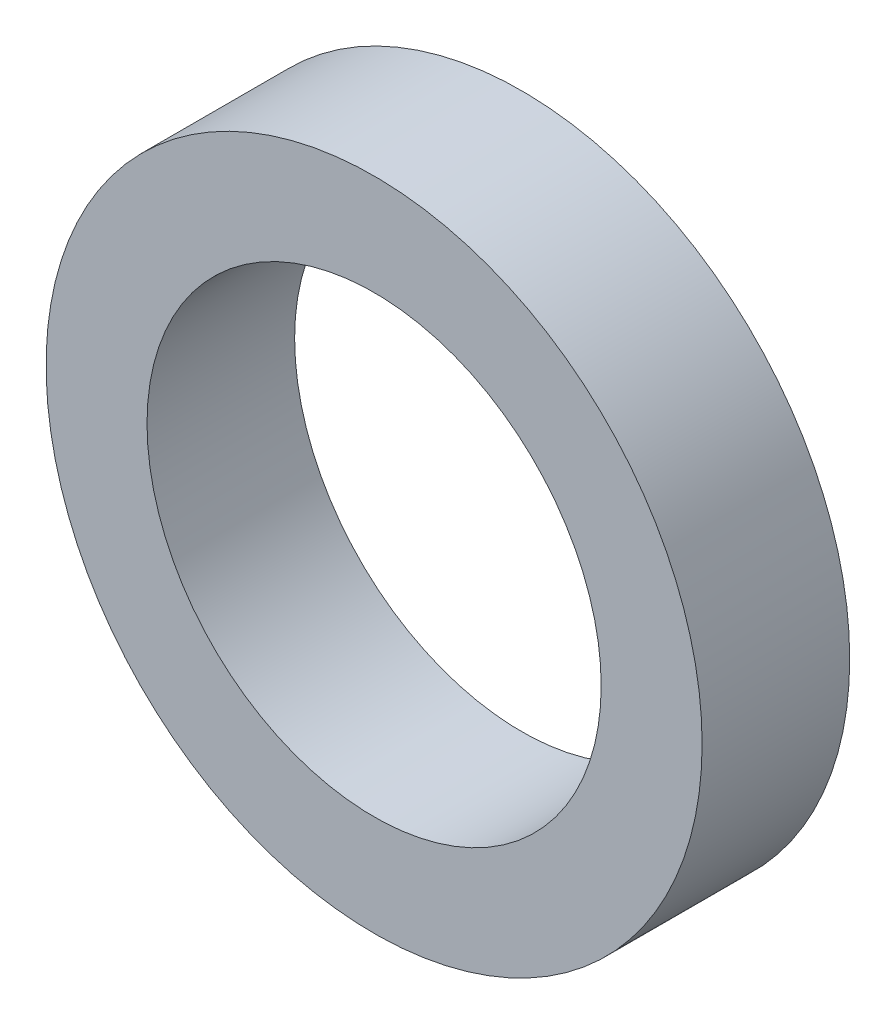
ISO-10303-21;
HEADER;
FILE_DESCRIPTION(('STEP AP214'),'2;1');
FILE_NAME('part.step','',(''),(''),'','','');
FILE_SCHEMA(('AUTOMOTIVE_DESIGN { 1 0 10303 214 1 1 1 1 }'));
ENDSEC;
DATA;
#1=APPLICATION_CONTEXT('core data for automotive mechanical design processes');
#2=APPLICATION_PROTOCOL_DEFINITION('international standard','automotive_design',2000,#1);
#3=PRODUCT_CONTEXT('',#1,'mechanical');
#4=PRODUCT('Part','Part','',(#3));
#5=PRODUCT_RELATED_PRODUCT_CATEGORY('part','',(#4));
#6=PRODUCT_DEFINITION_FORMATION('','',#4);
#7=PRODUCT_DEFINITION_CONTEXT('part definition',#1,'design');
#8=PRODUCT_DEFINITION('design','',#6,#7);
#9=PRODUCT_DEFINITION_SHAPE('','',#8);
#10=(LENGTH_UNIT() NAMED_UNIT(*) SI_UNIT(.MILLI.,.METRE.));
#11=(NAMED_UNIT(*) PLANE_ANGLE_UNIT() SI_UNIT($,.RADIAN.));
#12=(NAMED_UNIT(*) SI_UNIT($,.STERADIAN.) SOLID_ANGLE_UNIT());
#13=UNCERTAINTY_MEASURE_WITH_UNIT(LENGTH_MEASURE(1.E-05),#10,'distance_accuracy_value','');
#14=(GEOMETRIC_REPRESENTATION_CONTEXT(3) GLOBAL_UNCERTAINTY_ASSIGNED_CONTEXT((#13)) GLOBAL_UNIT_ASSIGNED_CONTEXT((#10,
#11,#12)) REPRESENTATION_CONTEXT('',''));
#15=CARTESIAN_POINT('',(0.,0.,0.));
#16=DIRECTION('',(0.,0.,1.));
#17=DIRECTION('',(1.,0.,0.));
#18=AXIS2_PLACEMENT_3D('',#15,#16,#17);
#19=CARTESIAN_POINT('',(13.0091,13.0091,0.009099999999989));
#20=DIRECTION('',(0.,0.,1.));
#21=DIRECTION('',(1.,0.,0.));
#22=AXIS2_PLACEMENT_3D('',#19,#20,#21);
#23=CYLINDRICAL_SURFACE('',#22,9.);
#24=CARTESIAN_POINT('',(13.0091,13.0091,0.009099999999989));
#25=DIRECTION('',(0.,0.,1.));
#26=DIRECTION('',(1.,0.,0.));
#27=AXIS2_PLACEMENT_3D('',#24,#25,#26);
#28=CIRCLE('',#27,9.);
#29=CARTESIAN_POINT('',(22.0091,13.0091,0.009099999999989));
#30=VERTEX_POINT('',#29);
#31=EDGE_CURVE('E26',#30,#30,#28,.F.);
#32=ORIENTED_EDGE('',*,*,#31,.T.);
#33=EDGE_LOOP('',(#32));
#34=FACE_BOUND('',#33,.T.);
#35=CARTESIAN_POINT('',(13.0091,13.0091,5.8591));
#36=DIRECTION('',(0.,0.,1.));
#37=DIRECTION('',(1.,0.,0.));
#38=AXIS2_PLACEMENT_3D('',#35,#36,#37);
#39=CIRCLE('',#38,9.);
#40=CARTESIAN_POINT('',(22.0091,13.0091,5.8591));
#41=VERTEX_POINT('',#40);
#42=EDGE_CURVE('E17',#41,#41,#39,.F.);
#43=ORIENTED_EDGE('',*,*,#42,.F.);
#44=EDGE_LOOP('',(#43));
#45=FACE_BOUND('',#44,.T.);
#46=ADVANCED_FACE('F14',(#34,#45),#23,.F.);
#47=CARTESIAN_POINT('',(13.0091,13.0091,5.8591));
#48=DIRECTION('',(0.,0.,1.));
#49=DIRECTION('',(1.,0.,0.));
#50=AXIS2_PLACEMENT_3D('',#47,#48,#49);
#51=PLANE('',#50);
#52=ORIENTED_EDGE('',*,*,#42,.T.);
#53=EDGE_LOOP('',(#52));
#54=FACE_BOUND('',#53,.T.);
#55=CARTESIAN_POINT('',(13.0091,13.0091,5.8591));
#56=DIRECTION('',(0.,0.,1.));
#57=DIRECTION('',(1.,0.,0.));
#58=AXIS2_PLACEMENT_3D('',#55,#56,#57);
#59=CIRCLE('',#58,13.);
#60=CARTESIAN_POINT('',(26.0091,13.0091,5.8591));
#61=VERTEX_POINT('',#60);
#62=EDGE_CURVE('E21',#61,#61,#59,.F.);
#63=ORIENTED_EDGE('',*,*,#62,.F.);
#64=EDGE_LOOP('',(#63));
#65=FACE_BOUND('',#64,.T.);
#66=ADVANCED_FACE('F34',(#54,#65),#51,.T.);
#67=CARTESIAN_POINT('',(13.0091,13.0091,0.009099999999989));
#68=DIRECTION('',(0.,0.,1.));
#69=DIRECTION('',(1.,0.,0.));
#70=AXIS2_PLACEMENT_3D('',#67,#68,#69);
#71=PLANE('',#70);
#72=ORIENTED_EDGE('',*,*,#31,.F.);
#73=EDGE_LOOP('',(#72));
#74=FACE_BOUND('',#73,.T.);
#75=CARTESIAN_POINT('',(13.0091,13.0091,0.009099999999989));
#76=DIRECTION('',(0.,0.,1.));
#77=DIRECTION('',(1.,0.,0.));
#78=AXIS2_PLACEMENT_3D('',#75,#76,#77);
#79=CIRCLE('',#78,13.);
#80=CARTESIAN_POINT('',(26.0091,13.0091,0.009099999999989));
#81=VERTEX_POINT('',#80);
#82=EDGE_CURVE('E10',#81,#81,#79,.T.);
#83=ORIENTED_EDGE('',*,*,#82,.F.);
#84=EDGE_LOOP('',(#83));
#85=FACE_BOUND('',#84,.T.);
#86=ADVANCED_FACE('F42',(#74,#85),#71,.F.);
#87=CARTESIAN_POINT('',(13.0091,13.0091,0.009099999999989));
#88=DIRECTION('',(0.,0.,1.));
#89=DIRECTION('',(1.,0.,0.));
#90=AXIS2_PLACEMENT_3D('',#87,#88,#89);
#91=CYLINDRICAL_SURFACE('',#90,13.);
#92=ORIENTED_EDGE('',*,*,#82,.T.);
#93=EDGE_LOOP('',(#92));
#94=FACE_BOUND('',#93,.T.);
#95=ORIENTED_EDGE('',*,*,#62,.T.);
#96=EDGE_LOOP('',(#95));
#97=FACE_BOUND('',#96,.T.);
#98=ADVANCED_FACE('F43',(#94,#97),#91,.T.);
#99=CLOSED_SHELL('',(#46,#66,#86,#98));
#100=MANIFOLD_SOLID_BREP('B1',#99);
#101=ADVANCED_BREP_SHAPE_REPRESENTATION('',(#18,#100),#14);
#102=SHAPE_DEFINITION_REPRESENTATION(#9,#101);
ENDSEC;
END-ISO-10303-21;
